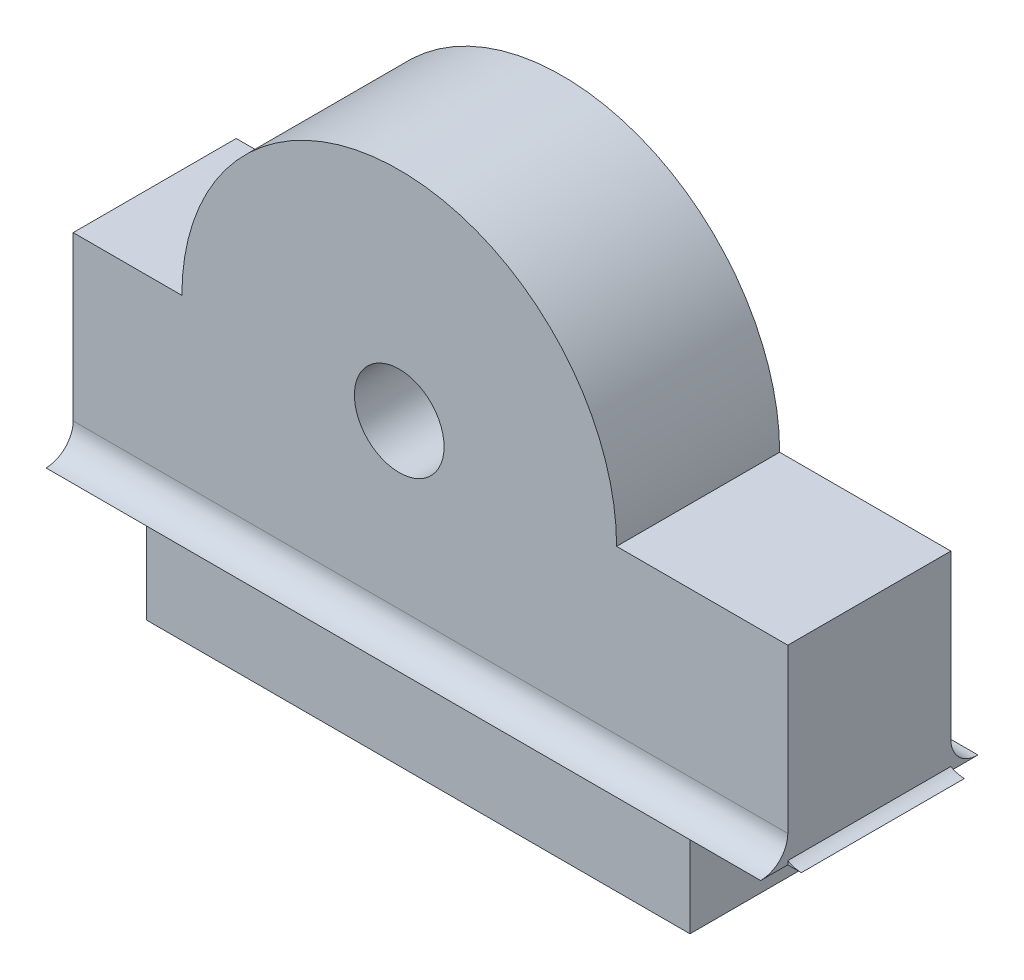
ISO-10303-21;
HEADER;
FILE_DESCRIPTION(('STEP AP214'),'2;1');
FILE_NAME('part.step','',(''),(''),'','','');
FILE_SCHEMA(('AUTOMOTIVE_DESIGN { 1 0 10303 214 1 1 1 1 }'));
ENDSEC;
DATA;
#1=APPLICATION_CONTEXT('core data for automotive mechanical design processes');
#2=APPLICATION_PROTOCOL_DEFINITION('international standard','automotive_design',2000,#1);
#3=PRODUCT_CONTEXT('',#1,'mechanical');
#4=PRODUCT('Part','Part','',(#3));
#5=PRODUCT_RELATED_PRODUCT_CATEGORY('part','',(#4));
#6=PRODUCT_DEFINITION_FORMATION('','',#4);
#7=PRODUCT_DEFINITION_CONTEXT('part definition',#1,'design');
#8=PRODUCT_DEFINITION('design','',#6,#7);
#9=PRODUCT_DEFINITION_SHAPE('','',#8);
#10=(LENGTH_UNIT() NAMED_UNIT(*) SI_UNIT(.MILLI.,.METRE.));
#11=(NAMED_UNIT(*) PLANE_ANGLE_UNIT() SI_UNIT($,.RADIAN.));
#12=(NAMED_UNIT(*) SI_UNIT($,.STERADIAN.) SOLID_ANGLE_UNIT());
#13=UNCERTAINTY_MEASURE_WITH_UNIT(LENGTH_MEASURE(1.E-05),#10,'distance_accuracy_value','');
#14=(GEOMETRIC_REPRESENTATION_CONTEXT(3) GLOBAL_UNCERTAINTY_ASSIGNED_CONTEXT((#13)) GLOBAL_UNIT_ASSIGNED_CONTEXT((#10,
#11,#12)) REPRESENTATION_CONTEXT('',''));
#15=CARTESIAN_POINT('',(0.,0.,0.));
#16=DIRECTION('',(0.,0.,1.));
#17=DIRECTION('',(1.,0.,0.));
#18=AXIS2_PLACEMENT_3D('',#15,#16,#17);
#19=CARTESIAN_POINT('',(9.3,11.,6.));
#20=DIRECTION('',(0.,0.,-1.));
#21=DIRECTION('',(-1.,0.,0.));
#22=AXIS2_PLACEMENT_3D('',#19,#20,#21);
#23=CYLINDRICAL_SURFACE('',#22,2.9);
#24=CARTESIAN_POINT('',(9.3,11.,0.));
#25=DIRECTION('',(0.,0.,-1.));
#26=DIRECTION('',(-1.,0.,0.));
#27=AXIS2_PLACEMENT_3D('',#24,#25,#26);
#28=CIRCLE('',#27,2.9);
#29=CARTESIAN_POINT('',(6.4,11.,0.));
#30=VERTEX_POINT('',#29);
#31=EDGE_CURVE('E162',#30,#30,#28,.T.);
#32=ORIENTED_EDGE('',*,*,#31,.T.);
#33=EDGE_LOOP('',(#32));
#34=FACE_BOUND('',#33,.T.);
#35=CARTESIAN_POINT('',(9.3,11.,3.));
#36=DIRECTION('',(0.,0.,1.));
#37=DIRECTION('',(1.,0.,0.));
#38=AXIS2_PLACEMENT_3D('',#35,#36,#37);
#39=CIRCLE('',#38,2.9);
#40=CARTESIAN_POINT('',(12.2,11.,3.));
#41=VERTEX_POINT('',#40);
#42=EDGE_CURVE('E359',#41,#41,#39,.T.);
#43=ORIENTED_EDGE('',*,*,#42,.T.);
#44=EDGE_LOOP('',(#43));
#45=FACE_BOUND('',#44,.T.);
#46=ADVANCED_FACE('F35',(#34,#45),#23,.F.);
#47=CARTESIAN_POINT('',(9.3,11.,0.));
#48=DIRECTION('',(0.,0.,1.));
#49=DIRECTION('',(1.,0.,0.));
#50=AXIS2_PLACEMENT_3D('',#47,#48,#49);
#51=PLANE('',#50);
#52=ORIENTED_EDGE('',*,*,#31,.F.);
#53=EDGE_LOOP('',(#52));
#54=FACE_BOUND('',#53,.T.);
#55=DIRECTION('',(-1.,0.,0.));
#56=VECTOR('',#55,1.);
#57=CARTESIAN_POINT('',(25.0142135623731,5.,0.));
#58=LINE('',#57,#56);
#59=CARTESIAN_POINT('',(23.6,5.,0.));
#60=VERTEX_POINT('',#59);
#61=CARTESIAN_POINT('',(23.1,5.,0.));
#62=VERTEX_POINT('',#61);
#63=EDGE_CURVE('E191',#60,#62,#58,.T.);
#64=ORIENTED_EDGE('',*,*,#63,.T.);
#65=CARTESIAN_POINT('',(-1.49999999999999,5.,0.));
#66=VERTEX_POINT('',#65);
#67=EDGE_CURVE('E197',#62,#66,#58,.T.);
#68=ORIENTED_EDGE('',*,*,#67,.T.);
#69=CARTESIAN_POINT('',(-2.7,5.,0.));
#70=VERTEX_POINT('',#69);
#71=EDGE_CURVE('E58',#66,#70,#58,.T.);
#72=ORIENTED_EDGE('',*,*,#71,.T.);
#73=DIRECTION('',(0.,-1.,0.));
#74=VECTOR('',#73,1.);
#75=CARTESIAN_POINT('',(-2.7,4.,0.));
#76=LINE('',#75,#74);
#77=CARTESIAN_POINT('',(-2.70000000000001,11.,0.));
#78=VERTEX_POINT('',#77);
#79=EDGE_CURVE('E222',#78,#70,#76,.T.);
#80=ORIENTED_EDGE('',*,*,#79,.F.);
#81=DIRECTION('',(-1.,0.,0.));
#82=VECTOR('',#81,1.);
#83=CARTESIAN_POINT('',(-2.70000000000001,11.,0.));
#84=LINE('',#83,#82);
#85=CARTESIAN_POINT('',(1.29999999999999,11.,0.));
#86=VERTEX_POINT('',#85);
#87=EDGE_CURVE('E250',#86,#78,#84,.T.);
#88=ORIENTED_EDGE('',*,*,#87,.F.);
#89=CARTESIAN_POINT('',(9.3,11.,0.));
#90=DIRECTION('',(0.,0.,1.));
#91=DIRECTION('',(1.,0.,0.));
#92=AXIS2_PLACEMENT_3D('',#89,#90,#91);
#93=CIRCLE('',#92,8.);
#94=CARTESIAN_POINT('',(17.3,11.,0.));
#95=VERTEX_POINT('',#94);
#96=EDGE_CURVE('E248',#95,#86,#93,.T.);
#97=ORIENTED_EDGE('',*,*,#96,.F.);
#98=DIRECTION('',(-1.,0.,0.));
#99=VECTOR('',#98,1.);
#100=CARTESIAN_POINT('',(17.3,11.,0.));
#101=LINE('',#100,#99);
#102=CARTESIAN_POINT('',(23.6,11.,0.));
#103=VERTEX_POINT('',#102);
#104=EDGE_CURVE('E246',#103,#95,#101,.T.);
#105=ORIENTED_EDGE('',*,*,#104,.F.);
#106=DIRECTION('',(0.,1.,0.));
#107=VECTOR('',#106,1.);
#108=CARTESIAN_POINT('',(23.6,11.,0.));
#109=LINE('',#108,#107);
#110=EDGE_CURVE('E244',#60,#103,#109,.T.);
#111=ORIENTED_EDGE('',*,*,#110,.F.);
#112=EDGE_LOOP('',(#64,#68,#72,#80,#88,#97,#105,#111));
#113=FACE_BOUND('',#112,.T.);
#114=ADVANCED_FACE('F302',(#54,#113),#51,.F.);
#115=CARTESIAN_POINT('',(9.3,11.,6.));
#116=DIRECTION('',(0.,0.,1.));
#117=DIRECTION('',(1.,0.,0.));
#118=AXIS2_PLACEMENT_3D('',#115,#116,#117);
#119=PLANE('',#118);
#120=DIRECTION('',(0.,-1.,0.));
#121=VECTOR('',#120,1.);
#122=CARTESIAN_POINT('',(-2.7,4.,6.));
#123=LINE('',#122,#121);
#124=CARTESIAN_POINT('',(-2.70000000000001,11.,6.));
#125=VERTEX_POINT('',#124);
#126=CARTESIAN_POINT('',(-2.7,5.,6.));
#127=VERTEX_POINT('',#126);
#128=EDGE_CURVE('E234',#125,#127,#123,.T.);
#129=ORIENTED_EDGE('',*,*,#128,.T.);
#130=DIRECTION('',(-1.,0.,0.));
#131=VECTOR('',#130,1.);
#132=CARTESIAN_POINT('',(25.0142135623731,5.,6.));
#133=LINE('',#132,#131);
#134=CARTESIAN_POINT('',(-1.49999999999999,5.,6.));
#135=VERTEX_POINT('',#134);
#136=EDGE_CURVE('E50',#135,#127,#133,.T.);
#137=ORIENTED_EDGE('',*,*,#136,.F.);
#138=CARTESIAN_POINT('',(23.1,5.,6.));
#139=VERTEX_POINT('',#138);
#140=EDGE_CURVE('E212',#139,#135,#133,.T.);
#141=ORIENTED_EDGE('',*,*,#140,.F.);
#142=CARTESIAN_POINT('',(23.6,5.,6.));
#143=VERTEX_POINT('',#142);
#144=EDGE_CURVE('E209',#143,#139,#133,.T.);
#145=ORIENTED_EDGE('',*,*,#144,.F.);
#146=DIRECTION('',(0.,1.,0.));
#147=VECTOR('',#146,1.);
#148=CARTESIAN_POINT('',(23.6,11.,6.));
#149=LINE('',#148,#147);
#150=CARTESIAN_POINT('',(23.6,11.,6.));
#151=VERTEX_POINT('',#150);
#152=EDGE_CURVE('E226',#143,#151,#149,.T.);
#153=ORIENTED_EDGE('',*,*,#152,.T.);
#154=DIRECTION('',(-1.,0.,0.));
#155=VECTOR('',#154,1.);
#156=CARTESIAN_POINT('',(17.3,11.,6.));
#157=LINE('',#156,#155);
#158=CARTESIAN_POINT('',(17.3,11.,6.));
#159=VERTEX_POINT('',#158);
#160=EDGE_CURVE('E228',#151,#159,#157,.T.);
#161=ORIENTED_EDGE('',*,*,#160,.T.);
#162=CARTESIAN_POINT('',(9.3,11.,6.));
#163=DIRECTION('',(0.,0.,1.));
#164=DIRECTION('',(1.,0.,0.));
#165=AXIS2_PLACEMENT_3D('',#162,#163,#164);
#166=CIRCLE('',#165,8.);
#167=CARTESIAN_POINT('',(1.29999999999999,11.,6.));
#168=VERTEX_POINT('',#167);
#169=EDGE_CURVE('E230',#159,#168,#166,.T.);
#170=ORIENTED_EDGE('',*,*,#169,.T.);
#171=DIRECTION('',(-1.,0.,0.));
#172=VECTOR('',#171,1.);
#173=CARTESIAN_POINT('',(-2.70000000000001,11.,6.));
#174=LINE('',#173,#172);
#175=EDGE_CURVE('E232',#168,#125,#174,.T.);
#176=ORIENTED_EDGE('',*,*,#175,.T.);
#177=EDGE_LOOP('',(#129,#137,#141,#145,#153,#161,#170,#176));
#178=FACE_BOUND('',#177,.T.);
#179=CARTESIAN_POINT('',(9.3,11.,6.));
#180=DIRECTION('',(0.,0.,1.));
#181=DIRECTION('',(1.,0.,0.));
#182=AXIS2_PLACEMENT_3D('',#179,#180,#181);
#183=CIRCLE('',#182,1.65);
#184=CARTESIAN_POINT('',(10.95,11.,6.));
#185=VERTEX_POINT('',#184);
#186=EDGE_CURVE('E363',#185,#185,#183,.T.);
#187=ORIENTED_EDGE('',*,*,#186,.F.);
#188=EDGE_LOOP('',(#187));
#189=FACE_BOUND('',#188,.T.);
#190=ADVANCED_FACE('F310',(#178,#189),#119,.T.);
#191=DIRECTION('',(-1.,0.,0.));
#192=VECTOR('',#191,1.);
#193=CARTESIAN_POINT('',(25.0142135623731,4.,6.));
#194=LINE('',#193,#192);
#195=CARTESIAN_POINT('',(20.,4.,6.));
#196=VERTEX_POINT('',#195);
#197=CARTESIAN_POINT('',(0.,4.,6.));
#198=VERTEX_POINT('',#197);
#199=EDGE_CURVE('E205',#196,#198,#194,.T.);
#200=ORIENTED_EDGE('',*,*,#199,.T.);
#201=DIRECTION('',(0.,-1.,0.));
#202=VECTOR('',#201,1.);
#203=CARTESIAN_POINT('',(0.,0.,6.));
#204=LINE('',#203,#202);
#205=CARTESIAN_POINT('',(0.,0.,6.));
#206=VERTEX_POINT('',#205);
#207=EDGE_CURVE('E218',#198,#206,#204,.T.);
#208=ORIENTED_EDGE('',*,*,#207,.T.);
#209=DIRECTION('',(1.,0.,0.));
#210=VECTOR('',#209,1.);
#211=CARTESIAN_POINT('',(0.,0.,6.));
#212=LINE('',#211,#210);
#213=CARTESIAN_POINT('',(20.,0.,6.));
#214=VERTEX_POINT('',#213);
#215=EDGE_CURVE('E221',#206,#214,#212,.T.);
#216=ORIENTED_EDGE('',*,*,#215,.T.);
#217=DIRECTION('',(0.,1.,0.));
#218=VECTOR('',#217,1.);
#219=CARTESIAN_POINT('',(20.,0.,6.));
#220=LINE('',#219,#218);
#221=EDGE_CURVE('E224',#214,#196,#220,.T.);
#222=ORIENTED_EDGE('',*,*,#221,.T.);
#223=EDGE_LOOP('',(#200,#208,#216,#222));
#224=FACE_BOUND('',#223,.T.);
#225=ADVANCED_FACE('F292',(#224),#119,.T.);
#226=DIRECTION('',(0.,-1.,0.));
#227=VECTOR('',#226,1.);
#228=CARTESIAN_POINT('',(0.,0.,0.));
#229=LINE('',#228,#227);
#230=CARTESIAN_POINT('',(0.,4.,0.));
#231=VERTEX_POINT('',#230);
#232=CARTESIAN_POINT('',(0.,0.,0.));
#233=VERTEX_POINT('',#232);
#234=EDGE_CURVE('E217',#231,#233,#229,.T.);
#235=ORIENTED_EDGE('',*,*,#234,.F.);
#236=DIRECTION('',(-1.,0.,0.));
#237=VECTOR('',#236,1.);
#238=CARTESIAN_POINT('',(25.0142135623731,4.,0.));
#239=LINE('',#238,#237);
#240=CARTESIAN_POINT('',(20.,4.,0.));
#241=VERTEX_POINT('',#240);
#242=EDGE_CURVE('E198',#241,#231,#239,.T.);
#243=ORIENTED_EDGE('',*,*,#242,.F.);
#244=DIRECTION('',(0.,1.,0.));
#245=VECTOR('',#244,1.);
#246=CARTESIAN_POINT('',(20.,0.,0.));
#247=LINE('',#246,#245);
#248=CARTESIAN_POINT('',(20.,0.,0.));
#249=VERTEX_POINT('',#248);
#250=EDGE_CURVE('E241',#249,#241,#247,.T.);
#251=ORIENTED_EDGE('',*,*,#250,.F.);
#252=DIRECTION('',(1.,0.,0.));
#253=VECTOR('',#252,1.);
#254=CARTESIAN_POINT('',(0.,0.,0.));
#255=LINE('',#254,#253);
#256=EDGE_CURVE('E239',#233,#249,#255,.T.);
#257=ORIENTED_EDGE('',*,*,#256,.F.);
#258=EDGE_LOOP('',(#235,#243,#251,#257));
#259=FACE_BOUND('',#258,.T.);
#260=ADVANCED_FACE('F285',(#259),#51,.F.);
#261=CARTESIAN_POINT('',(0.,0.,6.));
#262=DIRECTION('',(1.,0.,0.));
#263=DIRECTION('',(0.,0.,-1.));
#264=AXIS2_PLACEMENT_3D('',#261,#262,#263);
#265=PLANE('',#264);
#266=ORIENTED_EDGE('',*,*,#234,.T.);
#267=DIRECTION('',(0.,0.,-1.));
#268=VECTOR('',#267,1.);
#269=CARTESIAN_POINT('',(0.,0.,6.));
#270=LINE('',#269,#268);
#271=EDGE_CURVE('E11',#206,#233,#270,.T.);
#272=ORIENTED_EDGE('',*,*,#271,.F.);
#273=ORIENTED_EDGE('',*,*,#207,.F.);
#274=DIRECTION('',(0.,0.,-1.));
#275=VECTOR('',#274,1.);
#276=CARTESIAN_POINT('',(0.,4.,6.));
#277=LINE('',#276,#275);
#278=EDGE_CURVE('E236',#198,#231,#277,.T.);
#279=ORIENTED_EDGE('',*,*,#278,.T.);
#280=EDGE_LOOP('',(#266,#272,#273,#279));
#281=FACE_BOUND('',#280,.T.);
#282=ADVANCED_FACE('F37',(#281),#265,.F.);
#283=CARTESIAN_POINT('',(0.,0.,6.));
#284=DIRECTION('',(0.,1.,0.));
#285=DIRECTION('',(0.,0.,1.));
#286=AXIS2_PLACEMENT_3D('',#283,#284,#285);
#287=PLANE('',#286);
#288=ORIENTED_EDGE('',*,*,#256,.T.);
#289=DIRECTION('',(0.,0.,-1.));
#290=VECTOR('',#289,1.);
#291=CARTESIAN_POINT('',(20.,0.,6.));
#292=LINE('',#291,#290);
#293=EDGE_CURVE('E43',#214,#249,#292,.T.);
#294=ORIENTED_EDGE('',*,*,#293,.F.);
#295=ORIENTED_EDGE('',*,*,#215,.F.);
#296=ORIENTED_EDGE('',*,*,#271,.T.);
#297=EDGE_LOOP('',(#288,#294,#295,#296));
#298=FACE_BOUND('',#297,.T.);
#299=ADVANCED_FACE('F293',(#298),#287,.F.);
#300=CARTESIAN_POINT('',(20.,0.,6.));
#301=DIRECTION('',(-1.,0.,0.));
#302=DIRECTION('',(0.,0.,1.));
#303=AXIS2_PLACEMENT_3D('',#300,#301,#302);
#304=PLANE('',#303);
#305=ORIENTED_EDGE('',*,*,#250,.T.);
#306=DIRECTION('',(0.,0.,-1.));
#307=VECTOR('',#306,1.);
#308=CARTESIAN_POINT('',(20.,4.,6.));
#309=LINE('',#308,#307);
#310=EDGE_CURVE('E273',#196,#241,#309,.T.);
#311=ORIENTED_EDGE('',*,*,#310,.F.);
#312=ORIENTED_EDGE('',*,*,#221,.F.);
#313=ORIENTED_EDGE('',*,*,#293,.T.);
#314=EDGE_LOOP('',(#305,#311,#312,#313));
#315=FACE_BOUND('',#314,.T.);
#316=ADVANCED_FACE('F280',(#315),#304,.F.);
#317=CARTESIAN_POINT('',(23.6,11.,6.));
#318=DIRECTION('',(-1.,0.,0.));
#319=DIRECTION('',(0.,-1.,0.));
#320=AXIS2_PLACEMENT_3D('',#317,#318,#319);
#321=PLANE('',#320);
#322=DIRECTION('',(0.,0.,-1.));
#323=VECTOR('',#322,1.);
#324=CARTESIAN_POINT('',(23.6,4.,6.));
#325=LINE('',#324,#323);
#326=CARTESIAN_POINT('',(23.6,4.,7.));
#327=VERTEX_POINT('',#326);
#328=CARTESIAN_POINT('',(23.6,4.,6.));
#329=VERTEX_POINT('',#328);
#330=EDGE_CURVE('E271',#327,#329,#325,.T.);
#331=ORIENTED_EDGE('',*,*,#330,.T.);
#332=DIRECTION('',(0.,1.,0.));
#333=VECTOR('',#332,1.);
#334=CARTESIAN_POINT('',(23.6,11.,6.));
#335=LINE('',#334,#333);
#336=CARTESIAN_POINT('',(23.6,4.13397459621557,6.));
#337=VERTEX_POINT('',#336);
#338=EDGE_CURVE('E160',#329,#337,#335,.T.);
#339=ORIENTED_EDGE('',*,*,#338,.T.);
#340=DIRECTION('',(0.,0.,1.));
#341=VECTOR('',#340,1.);
#342=CARTESIAN_POINT('',(23.6,4.13397459621557,-1.4142135623731));
#343=LINE('',#342,#341);
#344=CARTESIAN_POINT('',(23.6,4.13397459621557,0.));
#345=VERTEX_POINT('',#344);
#346=EDGE_CURVE('E176',#337,#345,#343,.F.);
#347=ORIENTED_EDGE('',*,*,#346,.T.);
#348=DIRECTION('',(0.,1.,0.));
#349=VECTOR('',#348,1.);
#350=CARTESIAN_POINT('',(23.6,11.,0.));
#351=LINE('',#350,#349);
#352=CARTESIAN_POINT('',(23.6,4.,0.));
#353=VERTEX_POINT('',#352);
#354=EDGE_CURVE('E182',#353,#345,#351,.T.);
#355=ORIENTED_EDGE('',*,*,#354,.F.);
#356=CARTESIAN_POINT('',(23.6,4.,-1.));
#357=VERTEX_POINT('',#356);
#358=EDGE_CURVE('E270',#353,#357,#325,.T.);
#359=ORIENTED_EDGE('',*,*,#358,.T.);
#360=CARTESIAN_POINT('',(23.6,5.,-1.));
#361=DIRECTION('',(-1.,0.,0.));
#362=DIRECTION('',(0.,-1.,0.));
#363=AXIS2_PLACEMENT_3D('',#360,#361,#362);
#364=CIRCLE('',#363,1.);
#365=EDGE_CURVE('E188',#357,#60,#364,.T.);
#366=ORIENTED_EDGE('',*,*,#365,.T.);
#367=ORIENTED_EDGE('',*,*,#110,.T.);
#368=DIRECTION('',(0.,0.,-1.));
#369=VECTOR('',#368,1.);
#370=CARTESIAN_POINT('',(23.6,11.,6.));
#371=LINE('',#370,#369);
#372=EDGE_CURVE('E267',#151,#103,#371,.T.);
#373=ORIENTED_EDGE('',*,*,#372,.F.);
#374=ORIENTED_EDGE('',*,*,#152,.F.);
#375=CARTESIAN_POINT('',(23.6,5.,7.));
#376=DIRECTION('',(-1.,0.,0.));
#377=DIRECTION('',(0.,-1.,0.));
#378=AXIS2_PLACEMENT_3D('',#375,#376,#377);
#379=CIRCLE('',#378,1.);
#380=EDGE_CURVE('E208',#143,#327,#379,.T.);
#381=ORIENTED_EDGE('',*,*,#380,.T.);
#382=EDGE_LOOP('',(#331,#339,#347,#355,#359,#366,#367,#373,#374,#381));
#383=FACE_BOUND('',#382,.T.);
#384=ADVANCED_FACE('F299',(#383),#321,.F.);
#385=CARTESIAN_POINT('',(17.3,11.,6.));
#386=DIRECTION('',(0.,-1.,0.));
#387=DIRECTION('',(0.,0.,-1.));
#388=AXIS2_PLACEMENT_3D('',#385,#386,#387);
#389=PLANE('',#388);
#390=ORIENTED_EDGE('',*,*,#104,.T.);
#391=DIRECTION('',(0.,0.,-1.));
#392=VECTOR('',#391,1.);
#393=CARTESIAN_POINT('',(17.3,11.,6.));
#394=LINE('',#393,#392);
#395=EDGE_CURVE('E264',#159,#95,#394,.T.);
#396=ORIENTED_EDGE('',*,*,#395,.F.);
#397=ORIENTED_EDGE('',*,*,#160,.F.);
#398=ORIENTED_EDGE('',*,*,#372,.T.);
#399=EDGE_LOOP('',(#390,#396,#397,#398));
#400=FACE_BOUND('',#399,.T.);
#401=ADVANCED_FACE('F335',(#400),#389,.F.);
#402=CARTESIAN_POINT('',(9.3,11.,6.));
#403=DIRECTION('',(0.,0.,-1.));
#404=DIRECTION('',(-1.,0.,0.));
#405=AXIS2_PLACEMENT_3D('',#402,#403,#404);
#406=CYLINDRICAL_SURFACE('',#405,8.);
#407=ORIENTED_EDGE('',*,*,#96,.T.);
#408=DIRECTION('',(0.,0.,-1.));
#409=VECTOR('',#408,1.);
#410=CARTESIAN_POINT('',(1.29999999999999,11.,6.));
#411=LINE('',#410,#409);
#412=EDGE_CURVE('E261',#168,#86,#411,.T.);
#413=ORIENTED_EDGE('',*,*,#412,.F.);
#414=ORIENTED_EDGE('',*,*,#169,.F.);
#415=ORIENTED_EDGE('',*,*,#395,.T.);
#416=EDGE_LOOP('',(#407,#413,#414,#415));
#417=FACE_BOUND('',#416,.T.);
#418=ADVANCED_FACE('F331',(#417),#406,.T.);
#419=CARTESIAN_POINT('',(-2.70000000000001,11.,6.));
#420=DIRECTION('',(0.,-1.,0.));
#421=DIRECTION('',(0.,0.,-1.));
#422=AXIS2_PLACEMENT_3D('',#419,#420,#421);
#423=PLANE('',#422);
#424=ORIENTED_EDGE('',*,*,#87,.T.);
#425=DIRECTION('',(0.,0.,-1.));
#426=VECTOR('',#425,1.);
#427=CARTESIAN_POINT('',(-2.70000000000001,11.,6.));
#428=LINE('',#427,#426);
#429=EDGE_CURVE('E258',#125,#78,#428,.T.);
#430=ORIENTED_EDGE('',*,*,#429,.F.);
#431=ORIENTED_EDGE('',*,*,#175,.F.);
#432=ORIENTED_EDGE('',*,*,#412,.T.);
#433=EDGE_LOOP('',(#424,#430,#431,#432));
#434=FACE_BOUND('',#433,.T.);
#435=ADVANCED_FACE('F327',(#434),#423,.F.);
#436=CARTESIAN_POINT('',(-2.7,4.,6.));
#437=DIRECTION('',(1.,0.,0.));
#438=DIRECTION('',(0.,1.,0.));
#439=AXIS2_PLACEMENT_3D('',#436,#437,#438);
#440=PLANE('',#439);
#441=ORIENTED_EDGE('',*,*,#79,.T.);
#442=CARTESIAN_POINT('',(-2.7,5.,-1.));
#443=DIRECTION('',(1.,0.,0.));
#444=DIRECTION('',(0.,0.,-1.));
#445=AXIS2_PLACEMENT_3D('',#442,#443,#444);
#446=CIRCLE('',#445,1.);
#447=CARTESIAN_POINT('',(-2.7,4.,-1.));
#448=VERTEX_POINT('',#447);
#449=EDGE_CURVE('E187',#70,#448,#446,.T.);
#450=ORIENTED_EDGE('',*,*,#449,.T.);
#451=DIRECTION('',(0.,0.,-1.));
#452=VECTOR('',#451,1.);
#453=CARTESIAN_POINT('',(-2.7,4.,6.));
#454=LINE('',#453,#452);
#455=CARTESIAN_POINT('',(-2.7,4.,7.));
#456=VERTEX_POINT('',#455);
#457=EDGE_CURVE('E256',#456,#448,#454,.T.);
#458=ORIENTED_EDGE('',*,*,#457,.F.);
#459=CARTESIAN_POINT('',(-2.7,5.,7.));
#460=DIRECTION('',(1.,0.,0.));
#461=DIRECTION('',(0.,0.,1.));
#462=AXIS2_PLACEMENT_3D('',#459,#460,#461);
#463=CIRCLE('',#462,1.);
#464=EDGE_CURVE('E190',#456,#127,#463,.T.);
#465=ORIENTED_EDGE('',*,*,#464,.T.);
#466=ORIENTED_EDGE('',*,*,#128,.F.);
#467=ORIENTED_EDGE('',*,*,#429,.T.);
#468=EDGE_LOOP('',(#441,#450,#458,#465,#466,#467));
#469=FACE_BOUND('',#468,.T.);
#470=ADVANCED_FACE('F324',(#469),#440,.F.);
#471=CARTESIAN_POINT('',(0.,4.,6.));
#472=DIRECTION('',(0.,1.,0.));
#473=DIRECTION('',(0.,0.,1.));
#474=AXIS2_PLACEMENT_3D('',#471,#472,#473);
#475=PLANE('',#474);
#476=ORIENTED_EDGE('',*,*,#242,.T.);
#477=ORIENTED_EDGE('',*,*,#278,.F.);
#478=ORIENTED_EDGE('',*,*,#199,.F.);
#479=ORIENTED_EDGE('',*,*,#310,.T.);
#480=EDGE_LOOP('',(#476,#477,#478,#479));
#481=FACE_BOUND('',#480,.T.);
#482=ORIENTED_EDGE('',*,*,#358,.F.);
#483=DIRECTION('',(-1.,0.,0.));
#484=VECTOR('',#483,1.);
#485=CARTESIAN_POINT('',(23.1,4.,0.));
#486=LINE('',#485,#484);
#487=CARTESIAN_POINT('',(24.1,4.,0.));
#488=VERTEX_POINT('',#487);
#489=EDGE_CURVE('E170',#488,#353,#486,.T.);
#490=ORIENTED_EDGE('',*,*,#489,.F.);
#491=DIRECTION('',(0.,0.,1.));
#492=VECTOR('',#491,1.);
#493=CARTESIAN_POINT('',(24.1,4.,-1.4142135623731));
#494=LINE('',#493,#492);
#495=CARTESIAN_POINT('',(24.1,4.,6.));
#496=VERTEX_POINT('',#495);
#497=EDGE_CURVE('E166',#488,#496,#494,.T.);
#498=ORIENTED_EDGE('',*,*,#497,.T.);
#499=DIRECTION('',(1.,0.,0.));
#500=VECTOR('',#499,1.);
#501=CARTESIAN_POINT('',(23.1,4.,6.));
#502=LINE('',#501,#500);
#503=EDGE_CURVE('E155',#329,#496,#502,.T.);
#504=ORIENTED_EDGE('',*,*,#503,.F.);
#505=ORIENTED_EDGE('',*,*,#330,.F.);
#506=DIRECTION('',(-1.,0.,0.));
#507=VECTOR('',#506,1.);
#508=CARTESIAN_POINT('',(25.0142135623731,4.,7.));
#509=LINE('',#508,#507);
#510=EDGE_CURVE('E204',#327,#456,#509,.T.);
#511=ORIENTED_EDGE('',*,*,#510,.T.);
#512=ORIENTED_EDGE('',*,*,#457,.T.);
#513=DIRECTION('',(-1.,0.,0.));
#514=VECTOR('',#513,1.);
#515=CARTESIAN_POINT('',(25.0142135623731,4.,-1.));
#516=LINE('',#515,#514);
#517=EDGE_CURVE('E194',#357,#448,#516,.T.);
#518=ORIENTED_EDGE('',*,*,#517,.F.);
#519=EDGE_LOOP('',(#482,#490,#498,#504,#505,#511,#512,#518));
#520=FACE_BOUND('',#519,.T.);
#521=ADVANCED_FACE('F168',(#481,#520),#475,.F.);
#522=CARTESIAN_POINT('',(25.0142135623731,5.,7.));
#523=DIRECTION('',(-1.,0.,0.));
#524=DIRECTION('',(0.,0.,1.));
#525=AXIS2_PLACEMENT_3D('',#522,#523,#524);
#526=CYLINDRICAL_SURFACE('',#525,1.);
#527=ORIENTED_EDGE('',*,*,#380,.F.);
#528=ORIENTED_EDGE('',*,*,#144,.T.);
#529=ORIENTED_EDGE('',*,*,#140,.T.);
#530=ORIENTED_EDGE('',*,*,#136,.T.);
#531=ORIENTED_EDGE('',*,*,#464,.F.);
#532=ORIENTED_EDGE('',*,*,#510,.F.);
#533=EDGE_LOOP('',(#527,#528,#529,#530,#531,#532));
#534=FACE_BOUND('',#533,.T.);
#535=ADVANCED_FACE('F317',(#534),#526,.F.);
#536=CARTESIAN_POINT('',(25.0142135623731,5.,-1.));
#537=DIRECTION('',(-1.,0.,0.));
#538=DIRECTION('',(0.,0.,1.));
#539=AXIS2_PLACEMENT_3D('',#536,#537,#538);
#540=CYLINDRICAL_SURFACE('',#539,1.);
#541=ORIENTED_EDGE('',*,*,#365,.F.);
#542=ORIENTED_EDGE('',*,*,#517,.T.);
#543=ORIENTED_EDGE('',*,*,#449,.F.);
#544=ORIENTED_EDGE('',*,*,#71,.F.);
#545=ORIENTED_EDGE('',*,*,#67,.F.);
#546=ORIENTED_EDGE('',*,*,#63,.F.);
#547=EDGE_LOOP('',(#541,#542,#543,#544,#545,#546));
#548=FACE_BOUND('',#547,.T.);
#549=ADVANCED_FACE('F353',(#548),#540,.F.);
#550=CARTESIAN_POINT('',(24.1,5.,6.));
#551=DIRECTION('',(0.,0.,1.));
#552=DIRECTION('',(1.,0.,0.));
#553=AXIS2_PLACEMENT_3D('',#550,#551,#552);
#554=PLANE('',#553);
#555=ORIENTED_EDGE('',*,*,#338,.F.);
#556=ORIENTED_EDGE('',*,*,#503,.T.);
#557=CARTESIAN_POINT('',(24.1,5.,6.));
#558=DIRECTION('',(0.,0.,-1.));
#559=DIRECTION('',(1.,0.,0.));
#560=AXIS2_PLACEMENT_3D('',#557,#558,#559);
#561=CIRCLE('',#560,1.);
#562=EDGE_CURVE('E159',#496,#337,#561,.T.);
#563=ORIENTED_EDGE('',*,*,#562,.T.);
#564=EDGE_LOOP('',(#555,#556,#563));
#565=FACE_BOUND('',#564,.T.);
#566=ADVANCED_FACE('F157',(#565),#554,.T.);
#567=CARTESIAN_POINT('',(24.1,5.,-1.4142135623731));
#568=DIRECTION('',(0.,0.,1.));
#569=DIRECTION('',(1.,0.,0.));
#570=AXIS2_PLACEMENT_3D('',#567,#568,#569);
#571=CYLINDRICAL_SURFACE('',#570,1.);
#572=ORIENTED_EDGE('',*,*,#346,.F.);
#573=ORIENTED_EDGE('',*,*,#562,.F.);
#574=ORIENTED_EDGE('',*,*,#497,.F.);
#575=CARTESIAN_POINT('',(24.1,5.,0.));
#576=DIRECTION('',(0.,0.,1.));
#577=DIRECTION('',(1.,0.,0.));
#578=AXIS2_PLACEMENT_3D('',#575,#576,#577);
#579=CIRCLE('',#578,1.);
#580=EDGE_CURVE('E180',#345,#488,#579,.T.);
#581=ORIENTED_EDGE('',*,*,#580,.F.);
#582=EDGE_LOOP('',(#572,#573,#574,#581));
#583=FACE_BOUND('',#582,.T.);
#584=ADVANCED_FACE('F175',(#583),#571,.F.);
#585=CARTESIAN_POINT('',(9.3,11.,0.));
#586=DIRECTION('',(0.,0.,1.));
#587=DIRECTION('',(1.,0.,0.));
#588=AXIS2_PLACEMENT_3D('',#585,#586,#587);
#589=PLANE('',#588);
#590=ORIENTED_EDGE('',*,*,#489,.T.);
#591=ORIENTED_EDGE('',*,*,#354,.T.);
#592=ORIENTED_EDGE('',*,*,#580,.T.);
#593=EDGE_LOOP('',(#590,#591,#592));
#594=FACE_BOUND('',#593,.T.);
#595=ADVANCED_FACE('F356',(#594),#589,.F.);
#596=CARTESIAN_POINT('',(9.3,11.,3.));
#597=DIRECTION('',(0.,0.,1.));
#598=DIRECTION('',(1.,0.,0.));
#599=AXIS2_PLACEMENT_3D('',#596,#597,#598);
#600=PLANE('',#599);
#601=CARTESIAN_POINT('',(9.3,11.,3.));
#602=DIRECTION('',(0.,0.,1.));
#603=DIRECTION('',(1.,0.,0.));
#604=AXIS2_PLACEMENT_3D('',#601,#602,#603);
#605=CIRCLE('',#604,1.65);
#606=CARTESIAN_POINT('',(10.95,11.,3.));
#607=VERTEX_POINT('',#606);
#608=EDGE_CURVE('E362',#607,#607,#605,.T.);
#609=ORIENTED_EDGE('',*,*,#608,.T.);
#610=EDGE_LOOP('',(#609));
#611=FACE_BOUND('',#610,.T.);
#612=ORIENTED_EDGE('',*,*,#42,.F.);
#613=EDGE_LOOP('',(#612));
#614=FACE_BOUND('',#613,.T.);
#615=ADVANCED_FACE('F369',(#611,#614),#600,.F.);
#616=CARTESIAN_POINT('',(9.3,11.,3.));
#617=DIRECTION('',(0.,0.,1.));
#618=DIRECTION('',(1.,0.,0.));
#619=AXIS2_PLACEMENT_3D('',#616,#617,#618);
#620=CYLINDRICAL_SURFACE('',#619,1.65);
#621=ORIENTED_EDGE('',*,*,#608,.F.);
#622=EDGE_LOOP('',(#621));
#623=FACE_BOUND('',#622,.T.);
#624=ORIENTED_EDGE('',*,*,#186,.T.);
#625=EDGE_LOOP('',(#624));
#626=FACE_BOUND('',#625,.T.);
#627=ADVANCED_FACE('F372',(#623,#626),#620,.F.);
#628=CLOSED_SHELL('',(#46,#114,#190,#225,#260,#282,#299,#316,#384,#401,#418,#435,#470,#521,#535,
#549,#566,#584,#595,#615,#627));
#629=MANIFOLD_SOLID_BREP('B2',#628);
#630=ADVANCED_BREP_SHAPE_REPRESENTATION('',(#18,#629),#14);
#631=SHAPE_DEFINITION_REPRESENTATION(#9,#630);
ENDSEC;
END-ISO-10303-21;
